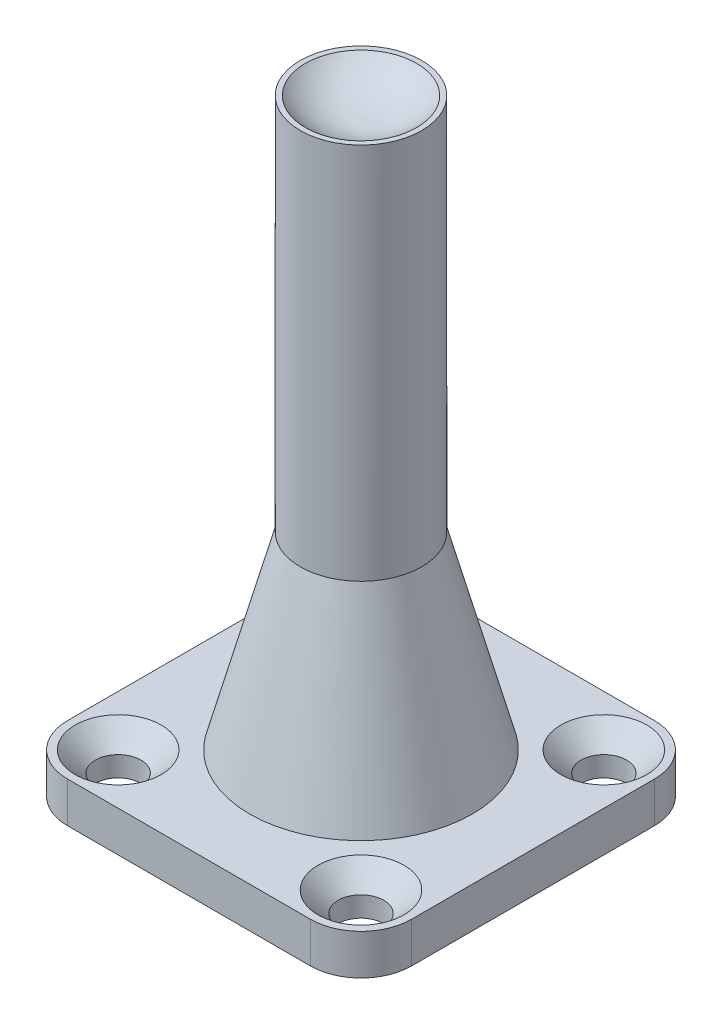
ISO-10303-21;
HEADER;
FILE_DESCRIPTION(('STEP AP214'),'2;1');
FILE_NAME('part.step','',(''),(''),'','','');
FILE_SCHEMA(('AUTOMOTIVE_DESIGN { 1 0 10303 214 1 1 1 1 }'));
ENDSEC;
DATA;
#1=APPLICATION_CONTEXT('core data for automotive mechanical design processes');
#2=APPLICATION_PROTOCOL_DEFINITION('international standard','automotive_design',2000,#1);
#3=PRODUCT_CONTEXT('',#1,'mechanical');
#4=PRODUCT('Part','Part','',(#3));
#5=PRODUCT_RELATED_PRODUCT_CATEGORY('part','',(#4));
#6=PRODUCT_DEFINITION_FORMATION('','',#4);
#7=PRODUCT_DEFINITION_CONTEXT('part definition',#1,'design');
#8=PRODUCT_DEFINITION('design','',#6,#7);
#9=PRODUCT_DEFINITION_SHAPE('','',#8);
#10=(LENGTH_UNIT() NAMED_UNIT(*) SI_UNIT(.MILLI.,.METRE.));
#11=(NAMED_UNIT(*) PLANE_ANGLE_UNIT() SI_UNIT($,.RADIAN.));
#12=(NAMED_UNIT(*) SI_UNIT($,.STERADIAN.) SOLID_ANGLE_UNIT());
#13=UNCERTAINTY_MEASURE_WITH_UNIT(LENGTH_MEASURE(1.E-05),#10,'distance_accuracy_value','');
#14=(GEOMETRIC_REPRESENTATION_CONTEXT(3) GLOBAL_UNCERTAINTY_ASSIGNED_CONTEXT((#13)) GLOBAL_UNIT_ASSIGNED_CONTEXT((#10,
#11,#12)) REPRESENTATION_CONTEXT('',''));
#15=CARTESIAN_POINT('',(0.,0.,0.));
#16=DIRECTION('',(0.,0.,1.));
#17=DIRECTION('',(1.,0.,0.));
#18=AXIS2_PLACEMENT_3D('',#15,#16,#17);
#19=CARTESIAN_POINT('',(0.,4.,0.));
#20=DIRECTION('',(0.,-1.,0.));
#21=DIRECTION('',(0.,0.,-1.));
#22=AXIS2_PLACEMENT_3D('',#19,#20,#21);
#23=PLANE('',#22);
#24=CARTESIAN_POINT('',(-12.,4.,12.));
#25=DIRECTION('',(0.,-1.,0.));
#26=DIRECTION('',(0.,0.,-1.));
#27=AXIS2_PLACEMENT_3D('',#24,#25,#26);
#28=CIRCLE('',#27,4.25000000000003);
#29=CARTESIAN_POINT('',(-12.,4.,7.74999999999997));
#30=VERTEX_POINT('',#29);
#31=EDGE_CURVE('E247',#30,#30,#28,.T.);
#32=ORIENTED_EDGE('',*,*,#31,.T.);
#33=EDGE_LOOP('',(#32));
#34=FACE_BOUND('',#33,.T.);
#35=CARTESIAN_POINT('',(12.,4.,12.));
#36=DIRECTION('',(0.,-1.,0.));
#37=DIRECTION('',(0.,0.,-1.));
#38=AXIS2_PLACEMENT_3D('',#35,#36,#37);
#39=CIRCLE('',#38,4.25000000000003);
#40=CARTESIAN_POINT('',(12.,4.,7.74999999999997));
#41=VERTEX_POINT('',#40);
#42=EDGE_CURVE('E243',#41,#41,#39,.T.);
#43=ORIENTED_EDGE('',*,*,#42,.T.);
#44=EDGE_LOOP('',(#43));
#45=FACE_BOUND('',#44,.T.);
#46=CARTESIAN_POINT('',(-12.,4.,-12.));
#47=DIRECTION('',(0.,-1.,0.));
#48=DIRECTION('',(0.,0.,-1.));
#49=AXIS2_PLACEMENT_3D('',#46,#47,#48);
#50=CIRCLE('',#49,4.25000000000003);
#51=CARTESIAN_POINT('',(-12.,4.,-16.25));
#52=VERTEX_POINT('',#51);
#53=EDGE_CURVE('E239',#52,#52,#50,.T.);
#54=ORIENTED_EDGE('',*,*,#53,.T.);
#55=EDGE_LOOP('',(#54));
#56=FACE_BOUND('',#55,.T.);
#57=CARTESIAN_POINT('',(12.,4.,-12.));
#58=DIRECTION('',(0.,-1.,0.));
#59=DIRECTION('',(0.,0.,-1.));
#60=AXIS2_PLACEMENT_3D('',#57,#58,#59);
#61=CIRCLE('',#60,4.25000000000003);
#62=CARTESIAN_POINT('',(12.,4.,-16.25));
#63=VERTEX_POINT('',#62);
#64=EDGE_CURVE('E235',#63,#63,#61,.T.);
#65=ORIENTED_EDGE('',*,*,#64,.T.);
#66=EDGE_LOOP('',(#65));
#67=FACE_BOUND('',#66,.T.);
#68=CARTESIAN_POINT('',(0.,4.,0.));
#69=DIRECTION('',(0.,-1.,0.));
#70=DIRECTION('',(0.,0.,-1.));
#71=AXIS2_PLACEMENT_3D('',#68,#69,#70);
#72=CIRCLE('',#71,11.);
#73=CARTESIAN_POINT('',(0.,4.,-11.));
#74=VERTEX_POINT('',#73);
#75=EDGE_CURVE('E227',#74,#74,#72,.T.);
#76=ORIENTED_EDGE('',*,*,#75,.T.);
#77=EDGE_LOOP('',(#76));
#78=FACE_BOUND('',#77,.T.);
#79=DIRECTION('',(1.,0.,0.));
#80=VECTOR('',#79,1.);
#81=CARTESIAN_POINT('',(-17.,4.,17.));
#82=LINE('',#81,#80);
#83=CARTESIAN_POINT('',(-12.,4.,17.));
#84=VERTEX_POINT('',#83);
#85=CARTESIAN_POINT('',(12.,4.,17.));
#86=VERTEX_POINT('',#85);
#87=EDGE_CURVE('E156',#84,#86,#82,.T.);
#88=ORIENTED_EDGE('',*,*,#87,.T.);
#89=CARTESIAN_POINT('',(12.,4.,12.));
#90=DIRECTION('',(0.,-1.,0.));
#91=DIRECTION('',(0.,0.,-1.));
#92=AXIS2_PLACEMENT_3D('',#89,#90,#91);
#93=CIRCLE('',#92,5.);
#94=CARTESIAN_POINT('',(17.,4.,12.));
#95=VERTEX_POINT('',#94);
#96=EDGE_CURVE('E207',#86,#95,#93,.F.);
#97=ORIENTED_EDGE('',*,*,#96,.T.);
#98=DIRECTION('',(0.,0.,-1.));
#99=VECTOR('',#98,1.);
#100=CARTESIAN_POINT('',(17.,4.,17.));
#101=LINE('',#100,#99);
#102=CARTESIAN_POINT('',(17.,4.,-12.));
#103=VERTEX_POINT('',#102);
#104=EDGE_CURVE('E145',#95,#103,#101,.T.);
#105=ORIENTED_EDGE('',*,*,#104,.T.);
#106=CARTESIAN_POINT('',(12.,4.,-12.));
#107=DIRECTION('',(0.,-1.,0.));
#108=DIRECTION('',(0.,0.,-1.));
#109=AXIS2_PLACEMENT_3D('',#106,#107,#108);
#110=CIRCLE('',#109,5.);
#111=CARTESIAN_POINT('',(12.,4.,-17.));
#112=VERTEX_POINT('',#111);
#113=EDGE_CURVE('E202',#103,#112,#110,.F.);
#114=ORIENTED_EDGE('',*,*,#113,.T.);
#115=DIRECTION('',(-1.,0.,0.));
#116=VECTOR('',#115,1.);
#117=CARTESIAN_POINT('',(-17.,4.,-17.));
#118=LINE('',#117,#116);
#119=CARTESIAN_POINT('',(-12.,4.,-17.));
#120=VERTEX_POINT('',#119);
#121=EDGE_CURVE('E149',#112,#120,#118,.T.);
#122=ORIENTED_EDGE('',*,*,#121,.T.);
#123=CARTESIAN_POINT('',(-12.,4.,-12.));
#124=DIRECTION('',(0.,-1.,0.));
#125=DIRECTION('',(0.,0.,-1.));
#126=AXIS2_PLACEMENT_3D('',#123,#124,#125);
#127=CIRCLE('',#126,5.);
#128=CARTESIAN_POINT('',(-17.,4.,-12.));
#129=VERTEX_POINT('',#128);
#130=EDGE_CURVE('E65',#120,#129,#127,.F.);
#131=ORIENTED_EDGE('',*,*,#130,.T.);
#132=DIRECTION('',(0.,0.,1.));
#133=VECTOR('',#132,1.);
#134=CARTESIAN_POINT('',(-17.,4.,17.));
#135=LINE('',#134,#133);
#136=CARTESIAN_POINT('',(-17.,4.,12.));
#137=VERTEX_POINT('',#136);
#138=EDGE_CURVE('E153',#129,#137,#135,.T.);
#139=ORIENTED_EDGE('',*,*,#138,.T.);
#140=CARTESIAN_POINT('',(-12.,4.,12.));
#141=DIRECTION('',(0.,-1.,0.));
#142=DIRECTION('',(0.,0.,-1.));
#143=AXIS2_PLACEMENT_3D('',#140,#141,#142);
#144=CIRCLE('',#143,5.);
#145=EDGE_CURVE('E199',#137,#84,#144,.F.);
#146=ORIENTED_EDGE('',*,*,#145,.T.);
#147=EDGE_LOOP('',(#88,#97,#105,#114,#122,#131,#139,#146));
#148=FACE_BOUND('',#147,.T.);
#149=ADVANCED_FACE('F41',(#34,#45,#56,#67,#78,#148),#23,.F.);
#150=CARTESIAN_POINT('',(0.,0.,0.));
#151=DIRECTION('',(0.,-1.,0.));
#152=DIRECTION('',(0.,0.,-1.));
#153=AXIS2_PLACEMENT_3D('',#150,#151,#152);
#154=PLANE('',#153);
#155=CARTESIAN_POINT('',(12.,0.,12.));
#156=DIRECTION('',(0.,1.,0.));
#157=DIRECTION('',(0.,0.,1.));
#158=AXIS2_PLACEMENT_3D('',#155,#156,#157);
#159=CIRCLE('',#158,2.25);
#160=CARTESIAN_POINT('',(12.,0.,14.25));
#161=VERTEX_POINT('',#160);
#162=EDGE_CURVE('E132',#161,#161,#159,.T.);
#163=ORIENTED_EDGE('',*,*,#162,.T.);
#164=EDGE_LOOP('',(#163));
#165=FACE_BOUND('',#164,.T.);
#166=CARTESIAN_POINT('',(-12.,0.,-12.));
#167=DIRECTION('',(0.,1.,0.));
#168=DIRECTION('',(0.,0.,1.));
#169=AXIS2_PLACEMENT_3D('',#166,#167,#168);
#170=CIRCLE('',#169,2.25);
#171=CARTESIAN_POINT('',(-12.,0.,-9.75));
#172=VERTEX_POINT('',#171);
#173=EDGE_CURVE('E140',#172,#172,#170,.T.);
#174=ORIENTED_EDGE('',*,*,#173,.T.);
#175=EDGE_LOOP('',(#174));
#176=FACE_BOUND('',#175,.T.);
#177=DIRECTION('',(0.,0.,-1.));
#178=VECTOR('',#177,1.);
#179=CARTESIAN_POINT('',(17.,0.,17.));
#180=LINE('',#179,#178);
#181=CARTESIAN_POINT('',(17.,0.,12.));
#182=VERTEX_POINT('',#181);
#183=CARTESIAN_POINT('',(17.,0.,-12.));
#184=VERTEX_POINT('',#183);
#185=EDGE_CURVE('E144',#182,#184,#180,.T.);
#186=ORIENTED_EDGE('',*,*,#185,.F.);
#187=CARTESIAN_POINT('',(12.,0.,12.));
#188=DIRECTION('',(0.,-1.,0.));
#189=DIRECTION('',(0.,0.,-1.));
#190=AXIS2_PLACEMENT_3D('',#187,#188,#189);
#191=CIRCLE('',#190,5.);
#192=CARTESIAN_POINT('',(12.,0.,17.));
#193=VERTEX_POINT('',#192);
#194=EDGE_CURVE('E189',#182,#193,#191,.T.);
#195=ORIENTED_EDGE('',*,*,#194,.T.);
#196=DIRECTION('',(1.,0.,0.));
#197=VECTOR('',#196,1.);
#198=CARTESIAN_POINT('',(-17.,0.,17.));
#199=LINE('',#198,#197);
#200=CARTESIAN_POINT('',(-12.,0.,17.));
#201=VERTEX_POINT('',#200);
#202=EDGE_CURVE('E150',#201,#193,#199,.T.);
#203=ORIENTED_EDGE('',*,*,#202,.F.);
#204=CARTESIAN_POINT('',(-12.,0.,12.));
#205=DIRECTION('',(0.,-1.,0.));
#206=DIRECTION('',(0.,0.,-1.));
#207=AXIS2_PLACEMENT_3D('',#204,#205,#206);
#208=CIRCLE('',#207,5.);
#209=CARTESIAN_POINT('',(-17.,0.,12.));
#210=VERTEX_POINT('',#209);
#211=EDGE_CURVE('E180',#201,#210,#208,.T.);
#212=ORIENTED_EDGE('',*,*,#211,.T.);
#213=DIRECTION('',(0.,0.,1.));
#214=VECTOR('',#213,1.);
#215=CARTESIAN_POINT('',(-17.,0.,17.));
#216=LINE('',#215,#214);
#217=CARTESIAN_POINT('',(-17.,0.,-12.));
#218=VERTEX_POINT('',#217);
#219=EDGE_CURVE('E168',#218,#210,#216,.T.);
#220=ORIENTED_EDGE('',*,*,#219,.F.);
#221=CARTESIAN_POINT('',(-12.,0.,-12.));
#222=DIRECTION('',(0.,-1.,0.));
#223=DIRECTION('',(0.,0.,-1.));
#224=AXIS2_PLACEMENT_3D('',#221,#222,#223);
#225=CIRCLE('',#224,5.);
#226=CARTESIAN_POINT('',(-12.,0.,-17.));
#227=VERTEX_POINT('',#226);
#228=EDGE_CURVE('E186',#218,#227,#225,.T.);
#229=ORIENTED_EDGE('',*,*,#228,.T.);
#230=DIRECTION('',(-1.,0.,0.));
#231=VECTOR('',#230,1.);
#232=CARTESIAN_POINT('',(-17.,0.,-17.));
#233=LINE('',#232,#231);
#234=CARTESIAN_POINT('',(12.,0.,-17.));
#235=VERTEX_POINT('',#234);
#236=EDGE_CURVE('E164',#235,#227,#233,.T.);
#237=ORIENTED_EDGE('',*,*,#236,.F.);
#238=CARTESIAN_POINT('',(12.,0.,-12.));
#239=DIRECTION('',(0.,-1.,0.));
#240=DIRECTION('',(0.,0.,-1.));
#241=AXIS2_PLACEMENT_3D('',#238,#239,#240);
#242=CIRCLE('',#241,5.);
#243=EDGE_CURVE('E183',#235,#184,#242,.T.);
#244=ORIENTED_EDGE('',*,*,#243,.T.);
#245=EDGE_LOOP('',(#186,#195,#203,#212,#220,#229,#237,#244));
#246=FACE_BOUND('',#245,.T.);
#247=CARTESIAN_POINT('',(12.,0.,-12.));
#248=DIRECTION('',(0.,1.,0.));
#249=DIRECTION('',(0.,0.,1.));
#250=AXIS2_PLACEMENT_3D('',#247,#248,#249);
#251=CIRCLE('',#250,2.25);
#252=CARTESIAN_POINT('',(12.,0.,-9.75));
#253=VERTEX_POINT('',#252);
#254=EDGE_CURVE('E136',#253,#253,#251,.T.);
#255=ORIENTED_EDGE('',*,*,#254,.T.);
#256=EDGE_LOOP('',(#255));
#257=FACE_BOUND('',#256,.T.);
#258=CARTESIAN_POINT('',(-12.,0.,12.));
#259=DIRECTION('',(0.,1.,0.));
#260=DIRECTION('',(0.,0.,1.));
#261=AXIS2_PLACEMENT_3D('',#258,#259,#260);
#262=CIRCLE('',#261,2.25);
#263=CARTESIAN_POINT('',(-12.,0.,14.25));
#264=VERTEX_POINT('',#263);
#265=EDGE_CURVE('E126',#264,#264,#262,.T.);
#266=ORIENTED_EDGE('',*,*,#265,.T.);
#267=EDGE_LOOP('',(#266));
#268=FACE_BOUND('',#267,.T.);
#269=ADVANCED_FACE('F276',(#165,#176,#246,#257,#268),#154,.T.);
#270=CARTESIAN_POINT('',(17.,4.,17.));
#271=DIRECTION('',(-1.,0.,0.));
#272=DIRECTION('',(0.,0.,1.));
#273=AXIS2_PLACEMENT_3D('',#270,#271,#272);
#274=PLANE('',#273);
#275=ORIENTED_EDGE('',*,*,#104,.F.);
#276=DIRECTION('',(0.,-1.,0.));
#277=VECTOR('',#276,1.);
#278=CARTESIAN_POINT('',(17.,4.,12.));
#279=LINE('',#278,#277);
#280=EDGE_CURVE('E176',#95,#182,#279,.T.);
#281=ORIENTED_EDGE('',*,*,#280,.T.);
#282=ORIENTED_EDGE('',*,*,#185,.T.);
#283=DIRECTION('',(0.,-1.,0.));
#284=VECTOR('',#283,1.);
#285=CARTESIAN_POINT('',(17.,4.,-12.));
#286=LINE('',#285,#284);
#287=EDGE_CURVE('E160',#184,#103,#286,.F.);
#288=ORIENTED_EDGE('',*,*,#287,.T.);
#289=EDGE_LOOP('',(#275,#281,#282,#288));
#290=FACE_BOUND('',#289,.T.);
#291=ADVANCED_FACE('F282',(#290),#274,.F.);
#292=CARTESIAN_POINT('',(-17.,4.,-17.));
#293=DIRECTION('',(0.,0.,1.));
#294=DIRECTION('',(1.,0.,0.));
#295=AXIS2_PLACEMENT_3D('',#292,#293,#294);
#296=PLANE('',#295);
#297=ORIENTED_EDGE('',*,*,#236,.T.);
#298=DIRECTION('',(0.,-1.,0.));
#299=VECTOR('',#298,1.);
#300=CARTESIAN_POINT('',(-12.,4.,-17.));
#301=LINE('',#300,#299);
#302=EDGE_CURVE('E220',#227,#120,#301,.F.);
#303=ORIENTED_EDGE('',*,*,#302,.T.);
#304=ORIENTED_EDGE('',*,*,#121,.F.);
#305=DIRECTION('',(0.,-1.,0.));
#306=VECTOR('',#305,1.);
#307=CARTESIAN_POINT('',(12.,4.,-17.));
#308=LINE('',#307,#306);
#309=EDGE_CURVE('E216',#112,#235,#308,.T.);
#310=ORIENTED_EDGE('',*,*,#309,.T.);
#311=EDGE_LOOP('',(#297,#303,#304,#310));
#312=FACE_BOUND('',#311,.T.);
#313=ADVANCED_FACE('F296',(#312),#296,.F.);
#314=CARTESIAN_POINT('',(-17.,4.,17.));
#315=DIRECTION('',(1.,0.,0.));
#316=DIRECTION('',(0.,0.,-1.));
#317=AXIS2_PLACEMENT_3D('',#314,#315,#316);
#318=PLANE('',#317);
#319=ORIENTED_EDGE('',*,*,#138,.F.);
#320=DIRECTION('',(0.,-1.,0.));
#321=VECTOR('',#320,1.);
#322=CARTESIAN_POINT('',(-17.,4.,-12.));
#323=LINE('',#322,#321);
#324=EDGE_CURVE('E212',#129,#218,#323,.T.);
#325=ORIENTED_EDGE('',*,*,#324,.T.);
#326=ORIENTED_EDGE('',*,*,#219,.T.);
#327=DIRECTION('',(0.,-1.,0.));
#328=VECTOR('',#327,1.);
#329=CARTESIAN_POINT('',(-17.,4.,12.));
#330=LINE('',#329,#328);
#331=EDGE_CURVE('E58',#210,#137,#330,.F.);
#332=ORIENTED_EDGE('',*,*,#331,.T.);
#333=EDGE_LOOP('',(#319,#325,#326,#332));
#334=FACE_BOUND('',#333,.T.);
#335=ADVANCED_FACE('F292',(#334),#318,.F.);
#336=CARTESIAN_POINT('',(-17.,4.,17.));
#337=DIRECTION('',(0.,0.,-1.));
#338=DIRECTION('',(-1.,0.,0.));
#339=AXIS2_PLACEMENT_3D('',#336,#337,#338);
#340=PLANE('',#339);
#341=ORIENTED_EDGE('',*,*,#202,.T.);
#342=DIRECTION('',(0.,-1.,0.));
#343=VECTOR('',#342,1.);
#344=CARTESIAN_POINT('',(12.,4.,17.));
#345=LINE('',#344,#343);
#346=EDGE_CURVE('E196',#193,#86,#345,.F.);
#347=ORIENTED_EDGE('',*,*,#346,.T.);
#348=ORIENTED_EDGE('',*,*,#87,.F.);
#349=DIRECTION('',(0.,-1.,0.));
#350=VECTOR('',#349,1.);
#351=CARTESIAN_POINT('',(-12.,4.,17.));
#352=LINE('',#351,#350);
#353=EDGE_CURVE('E192',#84,#201,#352,.T.);
#354=ORIENTED_EDGE('',*,*,#353,.T.);
#355=EDGE_LOOP('',(#341,#347,#348,#354));
#356=FACE_BOUND('',#355,.T.);
#357=ADVANCED_FACE('F289',(#356),#340,.F.);
#358=CARTESIAN_POINT('',(-12.,4.,-12.));
#359=DIRECTION('',(0.,-1.,0.));
#360=DIRECTION('',(0.,0.,-1.));
#361=AXIS2_PLACEMENT_3D('',#358,#359,#360);
#362=CYLINDRICAL_SURFACE('',#361,2.25);
#363=CARTESIAN_POINT('',(-12.,1.99999999999998,-12.));
#364=DIRECTION('',(0.,-1.,0.));
#365=DIRECTION('',(0.,0.,-1.));
#366=AXIS2_PLACEMENT_3D('',#363,#364,#365);
#367=CIRCLE('',#366,2.25);
#368=CARTESIAN_POINT('',(-12.,1.99999999999998,-14.25));
#369=VERTEX_POINT('',#368);
#370=EDGE_CURVE('E51',#369,#369,#367,.F.);
#371=ORIENTED_EDGE('',*,*,#370,.T.);
#372=EDGE_LOOP('',(#371));
#373=FACE_BOUND('',#372,.T.);
#374=ORIENTED_EDGE('',*,*,#173,.F.);
#375=EDGE_LOOP('',(#374));
#376=FACE_BOUND('',#375,.T.);
#377=ADVANCED_FACE('F258',(#373,#376),#362,.F.);
#378=CARTESIAN_POINT('',(12.,4.,-12.));
#379=DIRECTION('',(0.,-1.,0.));
#380=DIRECTION('',(0.,0.,-1.));
#381=AXIS2_PLACEMENT_3D('',#378,#379,#380);
#382=CYLINDRICAL_SURFACE('',#381,2.25);
#383=CARTESIAN_POINT('',(12.,1.99999999999998,-12.));
#384=DIRECTION('',(0.,-1.,0.));
#385=DIRECTION('',(0.,0.,-1.));
#386=AXIS2_PLACEMENT_3D('',#383,#384,#385);
#387=CIRCLE('',#386,2.25);
#388=CARTESIAN_POINT('',(12.,1.99999999999998,-14.25));
#389=VERTEX_POINT('',#388);
#390=EDGE_CURVE('E11',#389,#389,#387,.F.);
#391=ORIENTED_EDGE('',*,*,#390,.T.);
#392=EDGE_LOOP('',(#391));
#393=FACE_BOUND('',#392,.T.);
#394=ORIENTED_EDGE('',*,*,#254,.F.);
#395=EDGE_LOOP('',(#394));
#396=FACE_BOUND('',#395,.T.);
#397=ADVANCED_FACE('F354',(#393,#396),#382,.F.);
#398=CARTESIAN_POINT('',(12.,4.,12.));
#399=DIRECTION('',(0.,-1.,0.));
#400=DIRECTION('',(0.,0.,-1.));
#401=AXIS2_PLACEMENT_3D('',#398,#399,#400);
#402=CYLINDRICAL_SURFACE('',#401,2.25);
#403=CARTESIAN_POINT('',(12.,1.99999999999998,12.));
#404=DIRECTION('',(0.,-1.,0.));
#405=DIRECTION('',(0.,0.,-1.));
#406=AXIS2_PLACEMENT_3D('',#403,#404,#405);
#407=CIRCLE('',#406,2.25);
#408=CARTESIAN_POINT('',(12.,1.99999999999998,9.75));
#409=VERTEX_POINT('',#408);
#410=EDGE_CURVE('E251',#409,#409,#407,.F.);
#411=ORIENTED_EDGE('',*,*,#410,.T.);
#412=EDGE_LOOP('',(#411));
#413=FACE_BOUND('',#412,.T.);
#414=ORIENTED_EDGE('',*,*,#162,.F.);
#415=EDGE_LOOP('',(#414));
#416=FACE_BOUND('',#415,.T.);
#417=ADVANCED_FACE('F347',(#413,#416),#402,.F.);
#418=CARTESIAN_POINT('',(-12.,4.,12.));
#419=DIRECTION('',(0.,-1.,0.));
#420=DIRECTION('',(0.,0.,-1.));
#421=AXIS2_PLACEMENT_3D('',#418,#419,#420);
#422=CYLINDRICAL_SURFACE('',#421,2.25);
#423=CARTESIAN_POINT('',(-12.,1.99999999999998,12.));
#424=DIRECTION('',(0.,-1.,0.));
#425=DIRECTION('',(0.,0.,-1.));
#426=AXIS2_PLACEMENT_3D('',#423,#424,#425);
#427=CIRCLE('',#426,2.25);
#428=CARTESIAN_POINT('',(-12.,1.99999999999998,9.75));
#429=VERTEX_POINT('',#428);
#430=EDGE_CURVE('E231',#429,#429,#427,.F.);
#431=ORIENTED_EDGE('',*,*,#430,.T.);
#432=EDGE_LOOP('',(#431));
#433=FACE_BOUND('',#432,.T.);
#434=ORIENTED_EDGE('',*,*,#265,.F.);
#435=EDGE_LOOP('',(#434));
#436=FACE_BOUND('',#435,.T.);
#437=ADVANCED_FACE('F307',(#433,#436),#422,.F.);
#438=CARTESIAN_POINT('',(12.,4.,12.));
#439=DIRECTION('',(0.,-1.,0.));
#440=DIRECTION('',(0.,0.,-1.));
#441=AXIS2_PLACEMENT_3D('',#438,#439,#440);
#442=CYLINDRICAL_SURFACE('',#441,5.);
#443=ORIENTED_EDGE('',*,*,#96,.F.);
#444=ORIENTED_EDGE('',*,*,#346,.F.);
#445=ORIENTED_EDGE('',*,*,#194,.F.);
#446=ORIENTED_EDGE('',*,*,#280,.F.);
#447=EDGE_LOOP('',(#443,#444,#445,#446));
#448=FACE_BOUND('',#447,.T.);
#449=ADVANCED_FACE('F303',(#448),#442,.T.);
#450=CARTESIAN_POINT('',(-12.,4.,-12.));
#451=DIRECTION('',(0.,-1.,0.));
#452=DIRECTION('',(0.,0.,-1.));
#453=AXIS2_PLACEMENT_3D('',#450,#451,#452);
#454=CYLINDRICAL_SURFACE('',#453,5.);
#455=ORIENTED_EDGE('',*,*,#130,.F.);
#456=ORIENTED_EDGE('',*,*,#302,.F.);
#457=ORIENTED_EDGE('',*,*,#228,.F.);
#458=ORIENTED_EDGE('',*,*,#324,.F.);
#459=EDGE_LOOP('',(#455,#456,#457,#458));
#460=FACE_BOUND('',#459,.T.);
#461=ADVANCED_FACE('F306',(#460),#454,.T.);
#462=CARTESIAN_POINT('',(12.,4.,-12.));
#463=DIRECTION('',(0.,-1.,0.));
#464=DIRECTION('',(0.,0.,-1.));
#465=AXIS2_PLACEMENT_3D('',#462,#463,#464);
#466=CYLINDRICAL_SURFACE('',#465,5.);
#467=ORIENTED_EDGE('',*,*,#113,.F.);
#468=ORIENTED_EDGE('',*,*,#287,.F.);
#469=ORIENTED_EDGE('',*,*,#243,.F.);
#470=ORIENTED_EDGE('',*,*,#309,.F.);
#471=EDGE_LOOP('',(#467,#468,#469,#470));
#472=FACE_BOUND('',#471,.T.);
#473=ADVANCED_FACE('F311',(#472),#466,.T.);
#474=CARTESIAN_POINT('',(-12.,4.,12.));
#475=DIRECTION('',(0.,-1.,0.));
#476=DIRECTION('',(0.,0.,-1.));
#477=AXIS2_PLACEMENT_3D('',#474,#475,#476);
#478=CYLINDRICAL_SURFACE('',#477,5.);
#479=ORIENTED_EDGE('',*,*,#145,.F.);
#480=ORIENTED_EDGE('',*,*,#331,.F.);
#481=ORIENTED_EDGE('',*,*,#211,.F.);
#482=ORIENTED_EDGE('',*,*,#353,.F.);
#483=EDGE_LOOP('',(#479,#480,#481,#482));
#484=FACE_BOUND('',#483,.T.);
#485=ADVANCED_FACE('F315',(#484),#478,.T.);
#486=CARTESIAN_POINT('',(0.,60.,0.));
#487=DIRECTION('',(0.,-1.,0.));
#488=DIRECTION('',(0.,0.,-1.));
#489=AXIS2_PLACEMENT_3D('',#486,#487,#488);
#490=CYLINDRICAL_SURFACE('',#489,6.);
#491=CARTESIAN_POINT('',(0.,22.6602540378449,0.));
#492=DIRECTION('',(0.,-1.,0.));
#493=DIRECTION('',(0.,0.,-1.));
#494=AXIS2_PLACEMENT_3D('',#491,#492,#493);
#495=CIRCLE('',#494,6.);
#496=CARTESIAN_POINT('',(0.,22.6602540378449,-6.));
#497=VERTEX_POINT('',#496);
#498=EDGE_CURVE('E223',#497,#497,#495,.F.);
#499=ORIENTED_EDGE('',*,*,#498,.T.);
#500=EDGE_LOOP('',(#499));
#501=FACE_BOUND('',#500,.T.);
#502=CARTESIAN_POINT('',(0.,60.,0.));
#503=DIRECTION('',(0.,1.,0.));
#504=DIRECTION('',(0.,0.,1.));
#505=AXIS2_PLACEMENT_3D('',#502,#503,#504);
#506=CIRCLE('',#505,6.);
#507=CARTESIAN_POINT('',(0.,60.,6.));
#508=VERTEX_POINT('',#507);
#509=EDGE_CURVE('E122',#508,#508,#506,.T.);
#510=ORIENTED_EDGE('',*,*,#509,.F.);
#511=EDGE_LOOP('',(#510));
#512=FACE_BOUND('',#511,.T.);
#513=ADVANCED_FACE('F319',(#501,#512),#490,.T.);
#514=CARTESIAN_POINT('',(0.,60.,0.));
#515=DIRECTION('',(0.,1.,0.));
#516=DIRECTION('',(0.,0.,1.));
#517=AXIS2_PLACEMENT_3D('',#514,#515,#516);
#518=PLANE('',#517);
#519=CARTESIAN_POINT('',(0.,60.,0.));
#520=DIRECTION('',(0.,1.,0.));
#521=DIRECTION('',(-1.,0.,0.));
#522=AXIS2_PLACEMENT_3D('',#519,#520,#521);
#523=CIRCLE('',#522,5.5);
#524=CARTESIAN_POINT('',(-5.5,60.,0.));
#525=VERTEX_POINT('',#524);
#526=EDGE_CURVE('E119',#525,#525,#523,.T.);
#527=ORIENTED_EDGE('',*,*,#526,.F.);
#528=EDGE_LOOP('',(#527));
#529=FACE_BOUND('',#528,.T.);
#530=ORIENTED_EDGE('',*,*,#509,.T.);
#531=EDGE_LOOP('',(#530));
#532=FACE_BOUND('',#531,.T.);
#533=ADVANCED_FACE('F115',(#529,#532),#518,.T.);
#534=CARTESIAN_POINT('',(-0.685459934313923,64.6774851806367,0.));
#535=DIRECTION('',(0.,0.,-1.));
#536=DIRECTION('',(-1.,0.,0.));
#537=AXIS2_PLACEMENT_3D('',#534,#535,#536);
#538=CIRCLE('',#537,6.71257503936994);
#539=TRIMMED_CURVE('',#538,(PARAMETER_VALUE(-1.67309043047333)),
(PARAMETER_VALUE(1.67309043047333)),.T.,.PARAMETER.);
#540=CARTESIAN_POINT('',(0.,64.6774851806367,0.));
#541=DIRECTION('',(0.,1.,0.));
#542=AXIS1_PLACEMENT('',#540,#541);
#543=SURFACE_OF_REVOLUTION('',#539,#542);
#544=CARTESIAN_POINT('',(0.,58.,0.));
#545=VERTEX_POINT('',#544);
#546=VERTEX_LOOP('',#545);
#547=FACE_BOUND('',#546,.T.);
#548=ORIENTED_EDGE('',*,*,#526,.T.);
#549=EDGE_LOOP('',(#548));
#550=FACE_BOUND('',#549,.T.);
#551=ADVANCED_FACE('F111',(#547,#550),#543,.F.);
#552=CARTESIAN_POINT('',(0.,22.6602540378449,0.));
#553=DIRECTION('',(0.,-1.,0.));
#554=DIRECTION('',(0.,0.,-1.));
#555=AXIS2_PLACEMENT_3D('',#552,#553,#554);
#556=CONICAL_SURFACE('',#555,6.,0.261799387799143);
#557=ORIENTED_EDGE('',*,*,#75,.F.);
#558=EDGE_LOOP('',(#557));
#559=FACE_BOUND('',#558,.T.);
#560=ORIENTED_EDGE('',*,*,#498,.F.);
#561=EDGE_LOOP('',(#560));
#562=FACE_BOUND('',#561,.T.);
#563=ADVANCED_FACE('F114',(#559,#562),#556,.T.);
#564=CARTESIAN_POINT('',(-12.,1.99999999999998,12.));
#565=DIRECTION('',(0.,1.,0.));
#566=DIRECTION('',(0.,0.,1.));
#567=AXIS2_PLACEMENT_3D('',#564,#565,#566);
#568=CONICAL_SURFACE('',#567,2.25,0.78539816339745);
#569=ORIENTED_EDGE('',*,*,#31,.F.);
#570=EDGE_LOOP('',(#569));
#571=FACE_BOUND('',#570,.T.);
#572=ORIENTED_EDGE('',*,*,#430,.F.);
#573=EDGE_LOOP('',(#572));
#574=FACE_BOUND('',#573,.T.);
#575=ADVANCED_FACE('F270',(#571,#574),#568,.F.);
#576=CARTESIAN_POINT('',(12.,1.99999999999998,12.));
#577=DIRECTION('',(0.,1.,0.));
#578=DIRECTION('',(0.,0.,1.));
#579=AXIS2_PLACEMENT_3D('',#576,#577,#578);
#580=CONICAL_SURFACE('',#579,2.25,0.78539816339745);
#581=ORIENTED_EDGE('',*,*,#42,.F.);
#582=EDGE_LOOP('',(#581));
#583=FACE_BOUND('',#582,.T.);
#584=ORIENTED_EDGE('',*,*,#410,.F.);
#585=EDGE_LOOP('',(#584));
#586=FACE_BOUND('',#585,.T.);
#587=ADVANCED_FACE('F263',(#583,#586),#580,.F.);
#588=CARTESIAN_POINT('',(-12.,1.99999999999998,-12.));
#589=DIRECTION('',(0.,1.,0.));
#590=DIRECTION('',(0.,0.,1.));
#591=AXIS2_PLACEMENT_3D('',#588,#589,#590);
#592=CONICAL_SURFACE('',#591,2.25,0.78539816339745);
#593=ORIENTED_EDGE('',*,*,#53,.F.);
#594=EDGE_LOOP('',(#593));
#595=FACE_BOUND('',#594,.T.);
#596=ORIENTED_EDGE('',*,*,#370,.F.);
#597=EDGE_LOOP('',(#596));
#598=FACE_BOUND('',#597,.T.);
#599=ADVANCED_FACE('F261',(#595,#598),#592,.F.);
#600=CARTESIAN_POINT('',(12.,1.99999999999998,-12.));
#601=DIRECTION('',(0.,1.,0.));
#602=DIRECTION('',(0.,0.,1.));
#603=AXIS2_PLACEMENT_3D('',#600,#601,#602);
#604=CONICAL_SURFACE('',#603,2.25,0.78539816339745);
#605=ORIENTED_EDGE('',*,*,#64,.F.);
#606=EDGE_LOOP('',(#605));
#607=FACE_BOUND('',#606,.T.);
#608=ORIENTED_EDGE('',*,*,#390,.F.);
#609=EDGE_LOOP('',(#608));
#610=FACE_BOUND('',#609,.T.);
#611=ADVANCED_FACE('F44',(#607,#610),#604,.F.);
#612=CLOSED_SHELL('',(#149,#269,#291,#313,#335,#357,#377,#397,#417,#437,#449,#461,#473,#485,
#513,#533,#551,#563,#575,#587,#599,#611));
#613=MANIFOLD_SOLID_BREP('B2',#612);
#614=ADVANCED_BREP_SHAPE_REPRESENTATION('',(#18,#613),#14);
#615=SHAPE_DEFINITION_REPRESENTATION(#9,#614);
ENDSEC;
END-ISO-10303-21;
